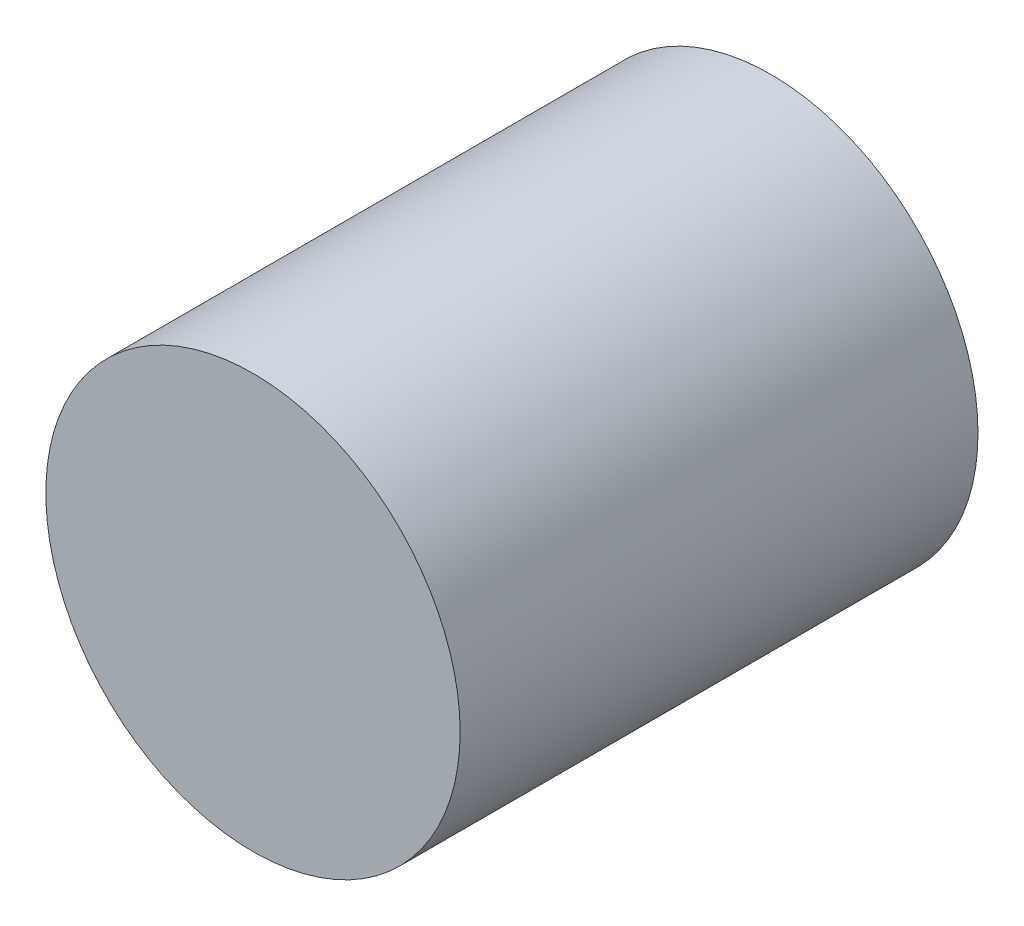
ISO-10303-21;
HEADER;
FILE_DESCRIPTION(('STEP AP214'),'2;1');
FILE_NAME('part.step','',(''),(''),'','','');
FILE_SCHEMA(('AUTOMOTIVE_DESIGN { 1 0 10303 214 1 1 1 1 }'));
ENDSEC;
DATA;
#1=APPLICATION_CONTEXT('core data for automotive mechanical design processes');
#2=APPLICATION_PROTOCOL_DEFINITION('international standard','automotive_design',2000,#1);
#3=PRODUCT_CONTEXT('',#1,'mechanical');
#4=PRODUCT('Part','Part','',(#3));
#5=PRODUCT_RELATED_PRODUCT_CATEGORY('part','',(#4));
#6=PRODUCT_DEFINITION_FORMATION('','',#4);
#7=PRODUCT_DEFINITION_CONTEXT('part definition',#1,'design');
#8=PRODUCT_DEFINITION('design','',#6,#7);
#9=PRODUCT_DEFINITION_SHAPE('','',#8);
#10=(LENGTH_UNIT() NAMED_UNIT(*) SI_UNIT(.MILLI.,.METRE.));
#11=(NAMED_UNIT(*) PLANE_ANGLE_UNIT() SI_UNIT($,.RADIAN.));
#12=(NAMED_UNIT(*) SI_UNIT($,.STERADIAN.) SOLID_ANGLE_UNIT());
#13=UNCERTAINTY_MEASURE_WITH_UNIT(LENGTH_MEASURE(1.E-05),#10,'distance_accuracy_value','');
#14=(GEOMETRIC_REPRESENTATION_CONTEXT(3) GLOBAL_UNCERTAINTY_ASSIGNED_CONTEXT((#13)) GLOBAL_UNIT_ASSIGNED_CONTEXT((#10,
#11,#12)) REPRESENTATION_CONTEXT('',''));
#15=CARTESIAN_POINT('',(0.,0.,0.));
#16=DIRECTION('',(0.,0.,1.));
#17=DIRECTION('',(1.,0.,0.));
#18=AXIS2_PLACEMENT_3D('',#15,#16,#17);
#19=CARTESIAN_POINT('',(0.,0.,15.));
#20=DIRECTION('',(0.,0.,-1.));
#21=DIRECTION('',(-1.,0.,0.));
#22=AXIS2_PLACEMENT_3D('',#19,#20,#21);
#23=CYLINDRICAL_SURFACE('',#22,6.);
#24=CARTESIAN_POINT('',(0.,0.,15.));
#25=DIRECTION('',(0.,0.,1.));
#26=DIRECTION('',(1.,0.,0.));
#27=AXIS2_PLACEMENT_3D('',#24,#25,#26);
#28=CIRCLE('',#27,6.);
#29=CARTESIAN_POINT('',(6.,0.,15.));
#30=VERTEX_POINT('',#29);
#31=EDGE_CURVE('E10',#30,#30,#28,.T.);
#32=ORIENTED_EDGE('',*,*,#31,.F.);
#33=EDGE_LOOP('',(#32));
#34=FACE_BOUND('',#33,.T.);
#35=CARTESIAN_POINT('',(0.,0.,0.));
#36=DIRECTION('',(0.,0.,1.));
#37=DIRECTION('',(1.,0.,0.));
#38=AXIS2_PLACEMENT_3D('',#35,#36,#37);
#39=CIRCLE('',#38,6.);
#40=CARTESIAN_POINT('',(6.,0.,0.));
#41=VERTEX_POINT('',#40);
#42=EDGE_CURVE('E46',#41,#41,#39,.T.);
#43=ORIENTED_EDGE('',*,*,#42,.T.);
#44=EDGE_LOOP('',(#43));
#45=FACE_BOUND('',#44,.T.);
#46=ADVANCED_FACE('F43',(#34,#45),#23,.T.);
#47=CARTESIAN_POINT('',(0.,0.,15.));
#48=DIRECTION('',(0.,0.,1.));
#49=DIRECTION('',(1.,0.,0.));
#50=AXIS2_PLACEMENT_3D('',#47,#48,#49);
#51=PLANE('',#50);
#52=ORIENTED_EDGE('',*,*,#31,.T.);
#53=EDGE_LOOP('',(#52));
#54=FACE_BOUND('',#53,.T.);
#55=ADVANCED_FACE('F60',(#54),#51,.T.);
#56=CARTESIAN_POINT('',(0.,0.,0.));
#57=DIRECTION('',(0.,0.,1.));
#58=DIRECTION('',(1.,0.,0.));
#59=AXIS2_PLACEMENT_3D('',#56,#57,#58);
#60=PLANE('',#59);
#61=ORIENTED_EDGE('',*,*,#42,.F.);
#62=EDGE_LOOP('',(#61));
#63=FACE_BOUND('',#62,.T.);
#64=ADVANCED_FACE('F58',(#63),#60,.F.);
#65=CLOSED_SHELL('',(#46,#55,#64));
#66=MANIFOLD_SOLID_BREP('B2',#65);
#67=ADVANCED_BREP_SHAPE_REPRESENTATION('',(#18,#66),#14);
#68=SHAPE_DEFINITION_REPRESENTATION(#9,#67);
ENDSEC;
END-ISO-10303-21;
